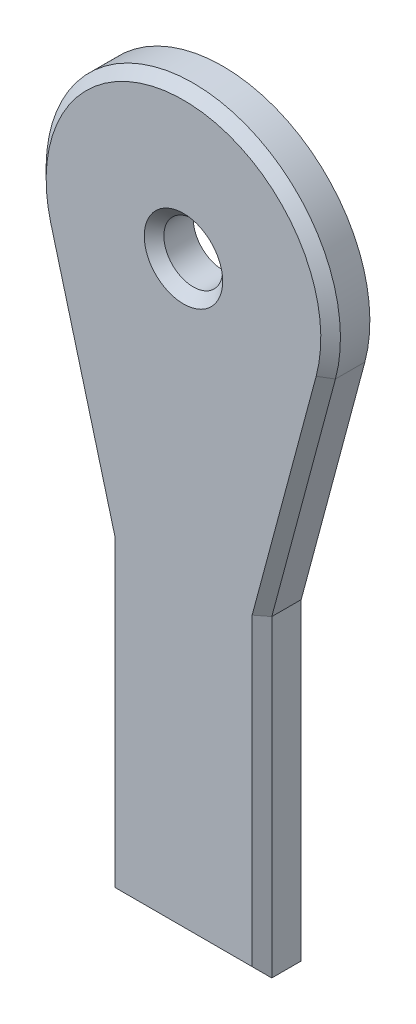
ISO-10303-21;
HEADER;
FILE_DESCRIPTION(('STEP AP214'),'2;1');
FILE_NAME('part.step','',(''),(''),'','','');
FILE_SCHEMA(('AUTOMOTIVE_DESIGN { 1 0 10303 214 1 1 1 1 }'));
ENDSEC;
DATA;
#1=APPLICATION_CONTEXT('core data for automotive mechanical design processes');
#2=APPLICATION_PROTOCOL_DEFINITION('international standard','automotive_design',2000,#1);
#3=PRODUCT_CONTEXT('',#1,'mechanical');
#4=PRODUCT('Part','Part','',(#3));
#5=PRODUCT_RELATED_PRODUCT_CATEGORY('part','',(#4));
#6=PRODUCT_DEFINITION_FORMATION('','',#4);
#7=PRODUCT_DEFINITION_CONTEXT('part definition',#1,'design');
#8=PRODUCT_DEFINITION('design','',#6,#7);
#9=PRODUCT_DEFINITION_SHAPE('','',#8);
#10=(LENGTH_UNIT() NAMED_UNIT(*) SI_UNIT(.MILLI.,.METRE.));
#11=(NAMED_UNIT(*) PLANE_ANGLE_UNIT() SI_UNIT($,.RADIAN.));
#12=(NAMED_UNIT(*) SI_UNIT($,.STERADIAN.) SOLID_ANGLE_UNIT());
#13=UNCERTAINTY_MEASURE_WITH_UNIT(LENGTH_MEASURE(1.E-05),#10,'distance_accuracy_value','');
#14=(GEOMETRIC_REPRESENTATION_CONTEXT(3) GLOBAL_UNCERTAINTY_ASSIGNED_CONTEXT((#13)) GLOBAL_UNIT_ASSIGNED_CONTEXT((#10,
#11,#12)) REPRESENTATION_CONTEXT('',''));
#15=CARTESIAN_POINT('',(0.,0.,0.));
#16=DIRECTION('',(0.,0.,1.));
#17=DIRECTION('',(1.,0.,0.));
#18=AXIS2_PLACEMENT_3D('',#15,#16,#17);
#19=CARTESIAN_POINT('',(0.,0.,10.));
#20=DIRECTION('',(0.,0.,1.));
#21=DIRECTION('',(1.,0.,0.));
#22=AXIS2_PLACEMENT_3D('',#19,#20,#21);
#23=PLANE('',#22);
#24=CARTESIAN_POINT('',(0.,0.,10.));
#25=DIRECTION('',(0.,0.,1.));
#26=DIRECTION('',(1.,0.,0.));
#27=AXIS2_PLACEMENT_3D('',#24,#25,#26);
#28=CIRCLE('',#27,10.);
#29=CARTESIAN_POINT('',(10.,0.,10.));
#30=VERTEX_POINT('',#29);
#31=EDGE_CURVE('E174',#30,#30,#28,.F.);
#32=ORIENTED_EDGE('',*,*,#31,.T.);
#33=EDGE_LOOP('',(#32));
#34=FACE_BOUND('',#33,.T.);
#35=DIRECTION('',(0.,1.,0.));
#36=VECTOR('',#35,1.);
#37=CARTESIAN_POINT('',(17.5000000000001,-70.2478577919825,10.));
#38=LINE('',#37,#36);
#39=CARTESIAN_POINT('',(17.5000000000001,-147.5,10.));
#40=VERTEX_POINT('',#39);
#41=CARTESIAN_POINT('',(17.5000000000001,-69.9187265480141,10.));
#42=VERTEX_POINT('',#41);
#43=EDGE_CURVE('E169',#40,#42,#38,.T.);
#44=ORIENTED_EDGE('',*,*,#43,.T.);
#45=DIRECTION('',(0.258819045102521,0.965925826289068,0.));
#46=VECTOR('',#45,1.);
#47=CARTESIAN_POINT('',(33.8074039201174,-9.05866657858826,10.));
#48=LINE('',#47,#46);
#49=CARTESIAN_POINT('',(33.8074039201174,-9.05866657858826,10.));
#50=VERTEX_POINT('',#49);
#51=EDGE_CURVE('E171',#42,#50,#48,.T.);
#52=ORIENTED_EDGE('',*,*,#51,.T.);
#53=CARTESIAN_POINT('',(0.,0.,10.));
#54=DIRECTION('',(0.,0.,1.));
#55=DIRECTION('',(1.,0.,0.));
#56=AXIS2_PLACEMENT_3D('',#53,#54,#55);
#57=CIRCLE('',#56,35.0000000000001);
#58=CARTESIAN_POINT('',(-33.8074039201174,-9.05866657858826,10.));
#59=VERTEX_POINT('',#58);
#60=EDGE_CURVE('E161',#50,#59,#57,.T.);
#61=ORIENTED_EDGE('',*,*,#60,.T.);
#62=DIRECTION('',(0.258819045102522,-0.965925826289068,0.));
#63=VECTOR('',#62,1.);
#64=CARTESIAN_POINT('',(-17.5851854342774,-69.6008101792263,10.));
#65=LINE('',#64,#63);
#66=CARTESIAN_POINT('',(-17.5,-69.9187265480141,10.));
#67=VERTEX_POINT('',#66);
#68=EDGE_CURVE('E163',#59,#67,#65,.T.);
#69=ORIENTED_EDGE('',*,*,#68,.T.);
#70=DIRECTION('',(0.,-1.,0.));
#71=VECTOR('',#70,1.);
#72=CARTESIAN_POINT('',(-17.5,-150.,10.));
#73=LINE('',#72,#71);
#74=CARTESIAN_POINT('',(-17.5,-147.5,10.));
#75=VERTEX_POINT('',#74);
#76=EDGE_CURVE('E165',#67,#75,#73,.T.);
#77=ORIENTED_EDGE('',*,*,#76,.T.);
#78=DIRECTION('',(1.,0.,0.));
#79=VECTOR('',#78,1.);
#80=CARTESIAN_POINT('',(20.,-147.5,10.));
#81=LINE('',#80,#79);
#82=EDGE_CURVE('E167',#75,#40,#81,.T.);
#83=ORIENTED_EDGE('',*,*,#82,.T.);
#84=EDGE_LOOP('',(#44,#52,#61,#69,#77,#83));
#85=FACE_BOUND('',#84,.T.);
#86=ADVANCED_FACE('F41',(#34,#85),#23,.T.);
#87=CARTESIAN_POINT('',(0.,0.,0.));
#88=DIRECTION('',(0.,0.,1.));
#89=DIRECTION('',(1.,0.,0.));
#90=AXIS2_PLACEMENT_3D('',#87,#88,#89);
#91=PLANE('',#90);
#92=CARTESIAN_POINT('',(0.,0.,0.));
#93=DIRECTION('',(0.,0.,1.));
#94=DIRECTION('',(1.,0.,0.));
#95=AXIS2_PLACEMENT_3D('',#92,#93,#94);
#96=CIRCLE('',#95,37.5);
#97=CARTESIAN_POINT('',(36.2222184858401,-9.70571419134455,0.));
#98=VERTEX_POINT('',#97);
#99=CARTESIAN_POINT('',(-36.2222184858401,-9.70571419134455,0.));
#100=VERTEX_POINT('',#99);
#101=EDGE_CURVE('E128',#98,#100,#96,.T.);
#102=ORIENTED_EDGE('',*,*,#101,.F.);
#103=DIRECTION('',(0.258819045102521,0.965925826289068,0.));
#104=VECTOR('',#103,1.);
#105=CARTESIAN_POINT('',(36.2222184858401,-9.70571419134455,0.));
#106=LINE('',#105,#104);
#107=CARTESIAN_POINT('',(20.,-70.2478577919825,0.));
#108=VERTEX_POINT('',#107);
#109=EDGE_CURVE('E149',#108,#98,#106,.T.);
#110=ORIENTED_EDGE('',*,*,#109,.F.);
#111=DIRECTION('',(0.,1.,0.));
#112=VECTOR('',#111,1.);
#113=CARTESIAN_POINT('',(20.,-70.2478577919825,0.));
#114=LINE('',#113,#112);
#115=CARTESIAN_POINT('',(20.,-150.,0.));
#116=VERTEX_POINT('',#115);
#117=EDGE_CURVE('E146',#116,#108,#114,.T.);
#118=ORIENTED_EDGE('',*,*,#117,.F.);
#119=DIRECTION('',(1.,0.,0.));
#120=VECTOR('',#119,1.);
#121=CARTESIAN_POINT('',(20.,-150.,0.));
#122=LINE('',#121,#120);
#123=CARTESIAN_POINT('',(-20.,-150.,0.));
#124=VERTEX_POINT('',#123);
#125=EDGE_CURVE('E143',#124,#116,#122,.T.);
#126=ORIENTED_EDGE('',*,*,#125,.F.);
#127=DIRECTION('',(0.,-1.,0.));
#128=VECTOR('',#127,1.);
#129=CARTESIAN_POINT('',(-20.,-70.2478577919825,0.));
#130=LINE('',#129,#128);
#131=CARTESIAN_POINT('',(-20.,-70.2478577919825,0.));
#132=VERTEX_POINT('',#131);
#133=EDGE_CURVE('E131',#132,#124,#130,.T.);
#134=ORIENTED_EDGE('',*,*,#133,.F.);
#135=DIRECTION('',(0.258819045102522,-0.965925826289068,0.));
#136=VECTOR('',#135,1.);
#137=CARTESIAN_POINT('',(-36.2222184858401,-9.70571419134455,0.));
#138=LINE('',#137,#136);
#139=EDGE_CURVE('E115',#100,#132,#138,.T.);
#140=ORIENTED_EDGE('',*,*,#139,.F.);
#141=EDGE_LOOP('',(#102,#110,#118,#126,#134,#140));
#142=FACE_BOUND('',#141,.T.);
#143=CARTESIAN_POINT('',(0.,0.,0.));
#144=DIRECTION('',(0.,0.,1.));
#145=DIRECTION('',(1.,0.,0.));
#146=AXIS2_PLACEMENT_3D('',#143,#144,#145);
#147=CIRCLE('',#146,7.5);
#148=CARTESIAN_POINT('',(7.5,0.,0.));
#149=VERTEX_POINT('',#148);
#150=EDGE_CURVE('E137',#149,#149,#147,.T.);
#151=ORIENTED_EDGE('',*,*,#150,.T.);
#152=EDGE_LOOP('',(#151));
#153=FACE_BOUND('',#152,.T.);
#154=ADVANCED_FACE('F125',(#142,#153),#91,.F.);
#155=CARTESIAN_POINT('',(0.,0.,10.));
#156=DIRECTION('',(0.,0.,-1.));
#157=DIRECTION('',(-1.,0.,0.));
#158=AXIS2_PLACEMENT_3D('',#155,#156,#157);
#159=CYLINDRICAL_SURFACE('',#158,37.5);
#160=DIRECTION('',(0.,0.,-1.));
#161=VECTOR('',#160,1.);
#162=CARTESIAN_POINT('',(-36.2222184858401,-9.70571419134455,10.));
#163=LINE('',#162,#161);
#164=CARTESIAN_POINT('',(-36.2222184858401,-9.70571419134455,7.50000000000003));
#165=VERTEX_POINT('',#164);
#166=EDGE_CURVE('E112',#165,#100,#163,.T.);
#167=ORIENTED_EDGE('',*,*,#166,.F.);
#168=CARTESIAN_POINT('',(0.,0.,7.50000000000003));
#169=DIRECTION('',(0.,0.,1.));
#170=DIRECTION('',(1.,0.,0.));
#171=AXIS2_PLACEMENT_3D('',#168,#169,#170);
#172=CIRCLE('',#171,37.5);
#173=CARTESIAN_POINT('',(36.2222184858401,-9.70571419134455,7.50000000000003));
#174=VERTEX_POINT('',#173);
#175=EDGE_CURVE('E11',#165,#174,#172,.F.);
#176=ORIENTED_EDGE('',*,*,#175,.T.);
#177=DIRECTION('',(0.,0.,-1.));
#178=VECTOR('',#177,1.);
#179=CARTESIAN_POINT('',(36.2222184858401,-9.70571419134455,10.));
#180=LINE('',#179,#178);
#181=EDGE_CURVE('E135',#174,#98,#180,.T.);
#182=ORIENTED_EDGE('',*,*,#181,.T.);
#183=ORIENTED_EDGE('',*,*,#101,.T.);
#184=EDGE_LOOP('',(#167,#176,#182,#183));
#185=FACE_BOUND('',#184,.T.);
#186=ADVANCED_FACE('F133',(#185),#159,.T.);
#187=CARTESIAN_POINT('',(-36.2222184858401,-9.70571419134455,10.));
#188=DIRECTION('',(0.965925826289068,0.258819045102522,0.));
#189=DIRECTION('',(-0.258819045102522,0.965925826289068,0.));
#190=AXIS2_PLACEMENT_3D('',#187,#188,#189);
#191=PLANE('',#190);
#192=DIRECTION('',(0.,0.,-1.));
#193=VECTOR('',#192,1.);
#194=CARTESIAN_POINT('',(-20.,-70.2478577919825,10.));
#195=LINE('',#194,#193);
#196=CARTESIAN_POINT('',(-20.,-70.2478577919825,7.50000000000002));
#197=VERTEX_POINT('',#196);
#198=EDGE_CURVE('E121',#197,#132,#195,.T.);
#199=ORIENTED_EDGE('',*,*,#198,.F.);
#200=DIRECTION('',(-0.258819045102522,0.965925826289068,0.));
#201=VECTOR('',#200,1.);
#202=CARTESIAN_POINT('',(-36.2222184858401,-9.70571419134455,7.50000000000002));
#203=LINE('',#202,#201);
#204=EDGE_CURVE('E51',#197,#165,#203,.T.);
#205=ORIENTED_EDGE('',*,*,#204,.T.);
#206=ORIENTED_EDGE('',*,*,#166,.T.);
#207=ORIENTED_EDGE('',*,*,#139,.T.);
#208=EDGE_LOOP('',(#199,#205,#206,#207));
#209=FACE_BOUND('',#208,.T.);
#210=ADVANCED_FACE('F114',(#209),#191,.F.);
#211=CARTESIAN_POINT('',(-20.,-70.2478577919825,10.));
#212=DIRECTION('',(1.,0.,0.));
#213=DIRECTION('',(0.,1.,0.));
#214=AXIS2_PLACEMENT_3D('',#211,#212,#213);
#215=PLANE('',#214);
#216=DIRECTION('',(0.,0.,-1.));
#217=VECTOR('',#216,1.);
#218=CARTESIAN_POINT('',(-20.,-150.,10.));
#219=LINE('',#218,#217);
#220=CARTESIAN_POINT('',(-20.,-150.,7.50000000000003));
#221=VERTEX_POINT('',#220);
#222=EDGE_CURVE('E156',#221,#124,#219,.T.);
#223=ORIENTED_EDGE('',*,*,#222,.F.);
#224=DIRECTION('',(0.,1.,0.));
#225=VECTOR('',#224,1.);
#226=CARTESIAN_POINT('',(-20.,-70.2478577919825,7.50000000000003));
#227=LINE('',#226,#225);
#228=EDGE_CURVE('E66',#221,#197,#227,.T.);
#229=ORIENTED_EDGE('',*,*,#228,.T.);
#230=ORIENTED_EDGE('',*,*,#198,.T.);
#231=ORIENTED_EDGE('',*,*,#133,.T.);
#232=EDGE_LOOP('',(#223,#229,#230,#231));
#233=FACE_BOUND('',#232,.T.);
#234=ADVANCED_FACE('F233',(#233),#215,.F.);
#235=CARTESIAN_POINT('',(20.,-150.,10.));
#236=DIRECTION('',(0.,1.,0.));
#237=DIRECTION('',(0.,0.,1.));
#238=AXIS2_PLACEMENT_3D('',#235,#236,#237);
#239=PLANE('',#238);
#240=DIRECTION('',(0.,0.,-1.));
#241=VECTOR('',#240,1.);
#242=CARTESIAN_POINT('',(20.,-150.,10.));
#243=LINE('',#242,#241);
#244=CARTESIAN_POINT('',(20.,-150.,7.50000000000003));
#245=VERTEX_POINT('',#244);
#246=EDGE_CURVE('E154',#245,#116,#243,.T.);
#247=ORIENTED_EDGE('',*,*,#246,.F.);
#248=DIRECTION('',(-1.,0.,0.));
#249=VECTOR('',#248,1.);
#250=CARTESIAN_POINT('',(-20.,-150.,7.50000000000003));
#251=LINE('',#250,#249);
#252=EDGE_CURVE('E182',#245,#221,#251,.T.);
#253=ORIENTED_EDGE('',*,*,#252,.T.);
#254=ORIENTED_EDGE('',*,*,#222,.T.);
#255=ORIENTED_EDGE('',*,*,#125,.T.);
#256=EDGE_LOOP('',(#247,#253,#254,#255));
#257=FACE_BOUND('',#256,.T.);
#258=ADVANCED_FACE('F231',(#257),#239,.F.);
#259=CARTESIAN_POINT('',(20.,-70.2478577919825,10.));
#260=DIRECTION('',(-1.,0.,0.));
#261=DIRECTION('',(0.,-1.,0.));
#262=AXIS2_PLACEMENT_3D('',#259,#260,#261);
#263=PLANE('',#262);
#264=DIRECTION('',(0.,0.,-1.));
#265=VECTOR('',#264,1.);
#266=CARTESIAN_POINT('',(20.,-70.2478577919825,10.));
#267=LINE('',#266,#265);
#268=CARTESIAN_POINT('',(20.,-70.2478577919825,7.50000000000003));
#269=VERTEX_POINT('',#268);
#270=EDGE_CURVE('E152',#269,#108,#267,.T.);
#271=ORIENTED_EDGE('',*,*,#270,.F.);
#272=DIRECTION('',(0.,-1.,0.));
#273=VECTOR('',#272,1.);
#274=CARTESIAN_POINT('',(20.,-150.,7.50000000000003));
#275=LINE('',#274,#273);
#276=EDGE_CURVE('E180',#269,#245,#275,.T.);
#277=ORIENTED_EDGE('',*,*,#276,.T.);
#278=ORIENTED_EDGE('',*,*,#246,.T.);
#279=ORIENTED_EDGE('',*,*,#117,.T.);
#280=EDGE_LOOP('',(#271,#277,#278,#279));
#281=FACE_BOUND('',#280,.T.);
#282=ADVANCED_FACE('F229',(#281),#263,.F.);
#283=CARTESIAN_POINT('',(36.2222184858401,-9.70571419134455,10.));
#284=DIRECTION('',(-0.965925826289068,0.258819045102521,0.));
#285=DIRECTION('',(-0.258819045102521,-0.965925826289068,0.));
#286=AXIS2_PLACEMENT_3D('',#283,#284,#285);
#287=PLANE('',#286);
#288=ORIENTED_EDGE('',*,*,#181,.F.);
#289=DIRECTION('',(-0.258819045102521,-0.965925826289068,0.));
#290=VECTOR('',#289,1.);
#291=CARTESIAN_POINT('',(20.,-70.2478577919825,7.50000000000003));
#292=LINE('',#291,#290);
#293=EDGE_CURVE('E177',#174,#269,#292,.T.);
#294=ORIENTED_EDGE('',*,*,#293,.T.);
#295=ORIENTED_EDGE('',*,*,#270,.T.);
#296=ORIENTED_EDGE('',*,*,#109,.T.);
#297=EDGE_LOOP('',(#288,#294,#295,#296));
#298=FACE_BOUND('',#297,.T.);
#299=ADVANCED_FACE('F217',(#298),#287,.F.);
#300=CARTESIAN_POINT('',(0.,0.,10.));
#301=DIRECTION('',(0.,0.,-1.));
#302=DIRECTION('',(-1.,0.,0.));
#303=AXIS2_PLACEMENT_3D('',#300,#301,#302);
#304=CYLINDRICAL_SURFACE('',#303,7.5);
#305=CARTESIAN_POINT('',(0.,0.,7.49999999999999));
#306=DIRECTION('',(0.,0.,1.));
#307=DIRECTION('',(1.,0.,0.));
#308=AXIS2_PLACEMENT_3D('',#305,#306,#307);
#309=CIRCLE('',#308,7.5);
#310=CARTESIAN_POINT('',(7.5,0.,7.49999999999999));
#311=VERTEX_POINT('',#310);
#312=EDGE_CURVE('E120',#311,#311,#309,.T.);
#313=ORIENTED_EDGE('',*,*,#312,.T.);
#314=EDGE_LOOP('',(#313));
#315=FACE_BOUND('',#314,.T.);
#316=ORIENTED_EDGE('',*,*,#150,.F.);
#317=EDGE_LOOP('',(#316));
#318=FACE_BOUND('',#317,.T.);
#319=ADVANCED_FACE('F251',(#315,#318),#304,.F.);
#320=CARTESIAN_POINT('',(0.,0.,7.49999999999999));
#321=DIRECTION('',(0.,0.,1.));
#322=DIRECTION('',(1.,0.,0.));
#323=AXIS2_PLACEMENT_3D('',#320,#321,#322);
#324=CONICAL_SURFACE('',#323,7.5,0.785398163397449);
#325=ORIENTED_EDGE('',*,*,#31,.F.);
#326=EDGE_LOOP('',(#325));
#327=FACE_BOUND('',#326,.T.);
#328=ORIENTED_EDGE('',*,*,#312,.F.);
#329=EDGE_LOOP('',(#328));
#330=FACE_BOUND('',#329,.T.);
#331=ADVANCED_FACE('F270',(#327,#330),#324,.F.);
#332=CARTESIAN_POINT('',(-17.5000000000001,0.,10.));
#333=DIRECTION('',(-0.707106781186552,0.,0.707106781186543));
#334=DIRECTION('',(0.,1.,0.));
#335=AXIS2_PLACEMENT_3D('',#332,#333,#334);
#336=PLANE('',#335);
#337=DIRECTION('',(0.704062592219632,0.0926915987235647,0.704062592219642));
#338=VECTOR('',#337,1.);
#339=CARTESIAN_POINT('',(-12.9370558521332,-69.3180035545956,14.5629441478669));
#340=LINE('',#339,#338);
#341=EDGE_CURVE('E195',#197,#67,#340,.T.);
#342=ORIENTED_EDGE('',*,*,#341,.F.);
#343=ORIENTED_EDGE('',*,*,#228,.F.);
#344=DIRECTION('',(0.577350269189623,0.577350269189624,0.577350269189631));
#345=VECTOR('',#344,1.);
#346=CARTESIAN_POINT('',(31.6666666666662,-98.3333333333337,59.1666666666669));
#347=LINE('',#346,#345);
#348=EDGE_CURVE('E46',#75,#221,#347,.F.);
#349=ORIENTED_EDGE('',*,*,#348,.F.);
#350=ORIENTED_EDGE('',*,*,#76,.F.);
#351=EDGE_LOOP('',(#342,#343,#349,#350));
#352=FACE_BOUND('',#351,.T.);
#353=ADVANCED_FACE('F44',(#352),#336,.T.);
#354=CARTESIAN_POINT('',(0.,-147.5,10.));
#355=DIRECTION('',(0.,-0.707106781186551,0.707106781186544));
#356=DIRECTION('',(-1.,0.,0.));
#357=AXIS2_PLACEMENT_3D('',#354,#355,#356);
#358=PLANE('',#357);
#359=ORIENTED_EDGE('',*,*,#348,.T.);
#360=ORIENTED_EDGE('',*,*,#252,.F.);
#361=DIRECTION('',(-0.577350269189625,0.577350269189623,0.57735026918963));
#362=VECTOR('',#361,1.);
#363=CARTESIAN_POINT('',(11.6666666666667,-141.666666666667,15.8333333333334));
#364=LINE('',#363,#362);
#365=EDGE_CURVE('E193',#40,#245,#364,.F.);
#366=ORIENTED_EDGE('',*,*,#365,.F.);
#367=ORIENTED_EDGE('',*,*,#82,.F.);
#368=EDGE_LOOP('',(#359,#360,#366,#367));
#369=FACE_BOUND('',#368,.T.);
#370=ADVANCED_FACE('F205',(#369),#358,.T.);
#371=CARTESIAN_POINT('',(-33.8074039201174,-9.05866657858827,10.));
#372=DIRECTION('',(-0.683012701892224,-0.183012701892221,0.707106781186542));
#373=DIRECTION('',(-0.258819045102522,0.965925826289068,0.));
#374=AXIS2_PLACEMENT_3D('',#371,#372,#373);
#375=PLANE('',#374);
#376=ORIENTED_EDGE('',*,*,#341,.T.);
#377=ORIENTED_EDGE('',*,*,#68,.F.);
#378=DIRECTION('',(0.683012701892214,0.183012701892219,0.707106781186553));
#379=VECTOR('',#378,1.);
#380=CARTESIAN_POINT('',(-36.2222184858401,-9.70571419134455,7.50000000000002));
#381=LINE('',#380,#379);
#382=EDGE_CURVE('E190',#165,#59,#381,.T.);
#383=ORIENTED_EDGE('',*,*,#382,.F.);
#384=ORIENTED_EDGE('',*,*,#204,.F.);
#385=EDGE_LOOP('',(#376,#377,#383,#384));
#386=FACE_BOUND('',#385,.T.);
#387=ADVANCED_FACE('F209',(#386),#375,.T.);
#388=CARTESIAN_POINT('',(17.5,0.,10.));
#389=DIRECTION('',(0.707106781186551,0.,0.707106781186544));
#390=DIRECTION('',(0.,-1.,0.));
#391=AXIS2_PLACEMENT_3D('',#388,#389,#390);
#392=PLANE('',#391);
#393=ORIENTED_EDGE('',*,*,#365,.T.);
#394=ORIENTED_EDGE('',*,*,#276,.F.);
#395=DIRECTION('',(-0.704062592219634,0.0926915987235545,0.704062592219641));
#396=VECTOR('',#395,1.);
#397=CARTESIAN_POINT('',(21.6118781929866,-70.4600655818958,5.88812180701342));
#398=LINE('',#397,#396);
#399=EDGE_CURVE('E188',#42,#269,#398,.F.);
#400=ORIENTED_EDGE('',*,*,#399,.F.);
#401=ORIENTED_EDGE('',*,*,#43,.F.);
#402=EDGE_LOOP('',(#393,#394,#400,#401));
#403=FACE_BOUND('',#402,.T.);
#404=ADVANCED_FACE('F226',(#403),#392,.T.);
#405=CARTESIAN_POINT('',(0.,0.,10.));
#406=DIRECTION('',(0.,0.,-1.));
#407=DIRECTION('',(-1.,0.,0.));
#408=AXIS2_PLACEMENT_3D('',#405,#406,#407);
#409=CONICAL_SURFACE('',#408,35.0000000000001,0.785398163397443);
#410=ORIENTED_EDGE('',*,*,#382,.T.);
#411=ORIENTED_EDGE('',*,*,#60,.F.);
#412=DIRECTION('',(-0.683012701892215,0.183012701892219,0.707106781186552));
#413=VECTOR('',#412,1.);
#414=CARTESIAN_POINT('',(36.2222184858401,-9.70571419134455,7.50000000000003));
#415=LINE('',#414,#413);
#416=EDGE_CURVE('E186',#174,#50,#415,.T.);
#417=ORIENTED_EDGE('',*,*,#416,.F.);
#418=ORIENTED_EDGE('',*,*,#175,.F.);
#419=EDGE_LOOP('',(#410,#411,#417,#418));
#420=FACE_BOUND('',#419,.T.);
#421=ADVANCED_FACE('F214',(#420),#409,.T.);
#422=CARTESIAN_POINT('',(33.8074039201174,-9.05866657858826,10.));
#423=DIRECTION('',(0.683012701892224,-0.183012701892221,0.707106781186542));
#424=DIRECTION('',(-0.258819045102521,-0.965925826289068,0.));
#425=AXIS2_PLACEMENT_3D('',#422,#423,#424);
#426=PLANE('',#425);
#427=ORIENTED_EDGE('',*,*,#399,.T.);
#428=ORIENTED_EDGE('',*,*,#293,.F.);
#429=ORIENTED_EDGE('',*,*,#416,.T.);
#430=ORIENTED_EDGE('',*,*,#51,.F.);
#431=EDGE_LOOP('',(#427,#428,#429,#430));
#432=FACE_BOUND('',#431,.T.);
#433=ADVANCED_FACE('F220',(#432),#426,.T.);
#434=CLOSED_SHELL('',(#86,#154,#186,#210,#234,#258,#282,#299,#319,#331,#353,#370,#387,#404,#421,#433));
#435=MANIFOLD_SOLID_BREP('B2',#434);
#436=ADVANCED_BREP_SHAPE_REPRESENTATION('',(#18,#435),#14);
#437=SHAPE_DEFINITION_REPRESENTATION(#9,#436);
ENDSEC;
END-ISO-10303-21;
